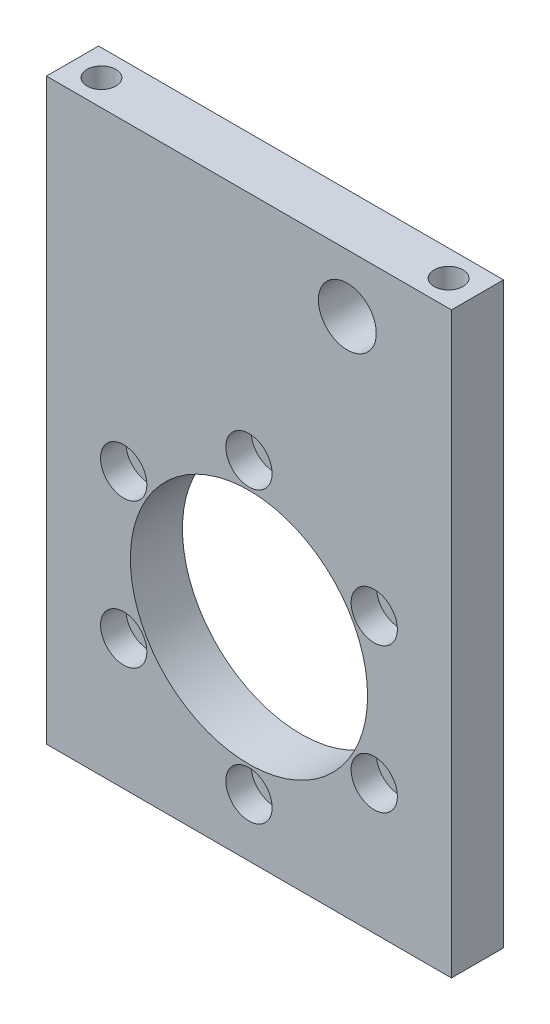
ISO-10303-21;
HEADER;
FILE_DESCRIPTION(('STEP AP214'),'2;1');
FILE_NAME('part.step','',(''),(''),'','','');
FILE_SCHEMA(('AUTOMOTIVE_DESIGN { 1 0 10303 214 1 1 1 1 }'));
ENDSEC;
DATA;
#1=APPLICATION_CONTEXT('core data for automotive mechanical design processes');
#2=APPLICATION_PROTOCOL_DEFINITION('international standard','automotive_design',2000,#1);
#3=PRODUCT_CONTEXT('',#1,'mechanical');
#4=PRODUCT('Part','Part','',(#3));
#5=PRODUCT_RELATED_PRODUCT_CATEGORY('part','',(#4));
#6=PRODUCT_DEFINITION_FORMATION('','',#4);
#7=PRODUCT_DEFINITION_CONTEXT('part definition',#1,'design');
#8=PRODUCT_DEFINITION('design','',#6,#7);
#9=PRODUCT_DEFINITION_SHAPE('','',#8);
#10=(LENGTH_UNIT() NAMED_UNIT(*) SI_UNIT(.MILLI.,.METRE.));
#11=(NAMED_UNIT(*) PLANE_ANGLE_UNIT() SI_UNIT($,.RADIAN.));
#12=(NAMED_UNIT(*) SI_UNIT($,.STERADIAN.) SOLID_ANGLE_UNIT());
#13=UNCERTAINTY_MEASURE_WITH_UNIT(LENGTH_MEASURE(1.E-05),#10,'distance_accuracy_value','');
#14=(GEOMETRIC_REPRESENTATION_CONTEXT(3) GLOBAL_UNCERTAINTY_ASSIGNED_CONTEXT((#13)) GLOBAL_UNIT_ASSIGNED_CONTEXT((#10,
#11,#12)) REPRESENTATION_CONTEXT('',''));
#15=CARTESIAN_POINT('',(0.,0.,0.));
#16=DIRECTION('',(0.,0.,1.));
#17=DIRECTION('',(1.,0.,0.));
#18=AXIS2_PLACEMENT_3D('',#15,#16,#17);
#19=CARTESIAN_POINT('',(0.,0.,4.5));
#20=DIRECTION('',(0.,0.,-1.));
#21=DIRECTION('',(-1.,0.,0.));
#22=AXIS2_PLACEMENT_3D('',#19,#20,#21);
#23=PLANE('',#22);
#24=CARTESIAN_POINT('',(52.,90.,4.5));
#25=DIRECTION('',(0.,0.,1.));
#26=DIRECTION('',(1.,0.,0.));
#27=AXIS2_PLACEMENT_3D('',#24,#25,#26);
#28=CIRCLE('',#27,5.);
#29=CARTESIAN_POINT('',(57.,90.,4.5));
#30=VERTEX_POINT('',#29);
#31=EDGE_CURVE('E301',#30,#30,#28,.T.);
#32=ORIENTED_EDGE('',*,*,#31,.F.);
#33=EDGE_LOOP('',(#32));
#34=FACE_BOUND('',#33,.T.);
#35=CARTESIAN_POINT('',(56.6506350946108,47.5000000000003,4.5));
#36=DIRECTION('',(0.,0.,1.));
#37=DIRECTION('',(1.,0.,0.));
#38=AXIS2_PLACEMENT_3D('',#35,#36,#37);
#39=CIRCLE('',#38,4.);
#40=CARTESIAN_POINT('',(60.6506350946108,47.5000000000003,4.5));
#41=VERTEX_POINT('',#40);
#42=EDGE_CURVE('E303',#41,#41,#39,.T.);
#43=ORIENTED_EDGE('',*,*,#42,.F.);
#44=EDGE_LOOP('',(#43));
#45=FACE_BOUND('',#44,.T.);
#46=CARTESIAN_POINT('',(56.6506350946111,22.5000000000002,4.5));
#47=DIRECTION('',(0.,0.,1.));
#48=DIRECTION('',(1.,0.,0.));
#49=AXIS2_PLACEMENT_3D('',#46,#47,#48);
#50=CIRCLE('',#49,4.);
#51=CARTESIAN_POINT('',(60.6506350946111,22.5000000000002,4.5));
#52=VERTEX_POINT('',#51);
#53=EDGE_CURVE('E316',#52,#52,#50,.T.);
#54=ORIENTED_EDGE('',*,*,#53,.F.);
#55=EDGE_LOOP('',(#54));
#56=FACE_BOUND('',#55,.T.);
#57=CARTESIAN_POINT('',(35.,10.,4.5));
#58=DIRECTION('',(0.,0.,1.));
#59=DIRECTION('',(1.,0.,0.));
#60=AXIS2_PLACEMENT_3D('',#57,#58,#59);
#61=CIRCLE('',#60,4.);
#62=CARTESIAN_POINT('',(39.,10.,4.5));
#63=VERTEX_POINT('',#62);
#64=EDGE_CURVE('E328',#63,#63,#61,.T.);
#65=ORIENTED_EDGE('',*,*,#64,.F.);
#66=EDGE_LOOP('',(#65));
#67=FACE_BOUND('',#66,.T.);
#68=CARTESIAN_POINT('',(13.3493649053891,22.4999999999999,4.5));
#69=DIRECTION('',(0.,0.,1.));
#70=DIRECTION('',(1.,0.,0.));
#71=AXIS2_PLACEMENT_3D('',#68,#69,#70);
#72=CIRCLE('',#71,4.);
#73=CARTESIAN_POINT('',(17.3493649053891,22.4999999999999,4.5));
#74=VERTEX_POINT('',#73);
#75=EDGE_CURVE('E340',#74,#74,#72,.T.);
#76=ORIENTED_EDGE('',*,*,#75,.F.);
#77=EDGE_LOOP('',(#76));
#78=FACE_BOUND('',#77,.T.);
#79=CARTESIAN_POINT('',(35.,60.,4.5));
#80=DIRECTION('',(0.,0.,1.));
#81=DIRECTION('',(1.,0.,0.));
#82=AXIS2_PLACEMENT_3D('',#79,#80,#81);
#83=CIRCLE('',#82,4.);
#84=CARTESIAN_POINT('',(39.,60.,4.5));
#85=VERTEX_POINT('',#84);
#86=EDGE_CURVE('E364',#85,#85,#83,.T.);
#87=ORIENTED_EDGE('',*,*,#86,.F.);
#88=EDGE_LOOP('',(#87));
#89=FACE_BOUND('',#88,.T.);
#90=CARTESIAN_POINT('',(35.,35.,4.5));
#91=DIRECTION('',(0.,0.,1.));
#92=DIRECTION('',(1.,0.,0.));
#93=AXIS2_PLACEMENT_3D('',#90,#91,#92);
#94=CIRCLE('',#93,20.5);
#95=CARTESIAN_POINT('',(55.5,35.,4.5));
#96=VERTEX_POINT('',#95);
#97=EDGE_CURVE('E135',#96,#96,#94,.T.);
#98=ORIENTED_EDGE('',*,*,#97,.F.);
#99=EDGE_LOOP('',(#98));
#100=FACE_BOUND('',#99,.T.);
#101=DIRECTION('',(0.,-1.,0.));
#102=VECTOR('',#101,1.);
#103=CARTESIAN_POINT('',(0.,0.,4.5));
#104=LINE('',#103,#102);
#105=CARTESIAN_POINT('',(0.,100.,4.5));
#106=VERTEX_POINT('',#105);
#107=CARTESIAN_POINT('',(0.,0.,4.5));
#108=VERTEX_POINT('',#107);
#109=EDGE_CURVE('E142',#106,#108,#104,.T.);
#110=ORIENTED_EDGE('',*,*,#109,.T.);
#111=DIRECTION('',(1.,0.,0.));
#112=VECTOR('',#111,1.);
#113=CARTESIAN_POINT('',(0.,0.,4.5));
#114=LINE('',#113,#112);
#115=CARTESIAN_POINT('',(70.,0.,4.5));
#116=VERTEX_POINT('',#115);
#117=EDGE_CURVE('E87',#108,#116,#114,.T.);
#118=ORIENTED_EDGE('',*,*,#117,.T.);
#119=DIRECTION('',(0.,1.,0.));
#120=VECTOR('',#119,1.);
#121=CARTESIAN_POINT('',(70.,0.,4.5));
#122=LINE('',#121,#120);
#123=CARTESIAN_POINT('',(70.,100.,4.5));
#124=VERTEX_POINT('',#123);
#125=EDGE_CURVE('E145',#116,#124,#122,.T.);
#126=ORIENTED_EDGE('',*,*,#125,.T.);
#127=DIRECTION('',(-1.,0.,0.));
#128=VECTOR('',#127,1.);
#129=CARTESIAN_POINT('',(0.,100.,4.5));
#130=LINE('',#129,#128);
#131=EDGE_CURVE('E56',#124,#106,#130,.T.);
#132=ORIENTED_EDGE('',*,*,#131,.T.);
#133=EDGE_LOOP('',(#110,#118,#126,#132));
#134=FACE_BOUND('',#133,.T.);
#135=CARTESIAN_POINT('',(13.349364905389,47.5,4.5));
#136=DIRECTION('',(0.,0.,1.));
#137=DIRECTION('',(1.,0.,0.));
#138=AXIS2_PLACEMENT_3D('',#135,#136,#137);
#139=CIRCLE('',#138,4.);
#140=CARTESIAN_POINT('',(17.349364905389,47.5,4.5));
#141=VERTEX_POINT('',#140);
#142=EDGE_CURVE('E352',#141,#141,#139,.T.);
#143=ORIENTED_EDGE('',*,*,#142,.F.);
#144=EDGE_LOOP('',(#143));
#145=FACE_BOUND('',#144,.T.);
#146=ADVANCED_FACE('F38',(#34,#45,#56,#67,#78,#89,#100,#134,#145),#23,.F.);
#147=CARTESIAN_POINT('',(0.,0.,4.5));
#148=DIRECTION('',(1.,0.,0.));
#149=DIRECTION('',(0.,0.,-1.));
#150=AXIS2_PLACEMENT_3D('',#147,#148,#149);
#151=PLANE('',#150);
#152=DIRECTION('',(0.,-1.,0.));
#153=VECTOR('',#152,1.);
#154=CARTESIAN_POINT('',(0.,0.,-4.5));
#155=LINE('',#154,#153);
#156=CARTESIAN_POINT('',(0.,100.,-4.5));
#157=VERTEX_POINT('',#156);
#158=CARTESIAN_POINT('',(0.,0.,-4.5));
#159=VERTEX_POINT('',#158);
#160=EDGE_CURVE('E141',#157,#159,#155,.T.);
#161=ORIENTED_EDGE('',*,*,#160,.T.);
#162=DIRECTION('',(0.,0.,-1.));
#163=VECTOR('',#162,1.);
#164=CARTESIAN_POINT('',(0.,0.,4.5));
#165=LINE('',#164,#163);
#166=EDGE_CURVE('E11',#108,#159,#165,.T.);
#167=ORIENTED_EDGE('',*,*,#166,.F.);
#168=ORIENTED_EDGE('',*,*,#109,.F.);
#169=DIRECTION('',(0.,0.,-1.));
#170=VECTOR('',#169,1.);
#171=CARTESIAN_POINT('',(0.,100.,4.5));
#172=LINE('',#171,#170);
#173=EDGE_CURVE('E148',#106,#157,#172,.T.);
#174=ORIENTED_EDGE('',*,*,#173,.T.);
#175=EDGE_LOOP('',(#161,#167,#168,#174));
#176=FACE_BOUND('',#175,.T.);
#177=ADVANCED_FACE('F40',(#176),#151,.F.);
#178=CARTESIAN_POINT('',(0.,0.,4.5));
#179=DIRECTION('',(0.,1.,0.));
#180=DIRECTION('',(0.,0.,1.));
#181=AXIS2_PLACEMENT_3D('',#178,#179,#180);
#182=PLANE('',#181);
#183=CARTESIAN_POINT('',(65.,0.,0.));
#184=DIRECTION('',(0.,-1.,0.));
#185=DIRECTION('',(0.,0.,-1.));
#186=AXIS2_PLACEMENT_3D('',#183,#184,#185);
#187=CIRCLE('',#186,2.49999999999999);
#188=CARTESIAN_POINT('',(65.,0.,-2.49999999999999));
#189=VERTEX_POINT('',#188);
#190=EDGE_CURVE('E123',#189,#189,#187,.T.);
#191=ORIENTED_EDGE('',*,*,#190,.F.);
#192=EDGE_LOOP('',(#191));
#193=FACE_BOUND('',#192,.T.);
#194=CARTESIAN_POINT('',(5.,0.,0.));
#195=DIRECTION('',(0.,-1.,0.));
#196=DIRECTION('',(0.,0.,-1.));
#197=AXIS2_PLACEMENT_3D('',#194,#195,#196);
#198=CIRCLE('',#197,2.49999999999999);
#199=CARTESIAN_POINT('',(5.,0.,-2.49999999999999));
#200=VERTEX_POINT('',#199);
#201=EDGE_CURVE('E129',#200,#200,#198,.T.);
#202=ORIENTED_EDGE('',*,*,#201,.F.);
#203=EDGE_LOOP('',(#202));
#204=FACE_BOUND('',#203,.T.);
#205=DIRECTION('',(1.,0.,0.));
#206=VECTOR('',#205,1.);
#207=CARTESIAN_POINT('',(0.,0.,-4.5));
#208=LINE('',#207,#206);
#209=CARTESIAN_POINT('',(70.,0.,-4.5));
#210=VERTEX_POINT('',#209);
#211=EDGE_CURVE('E151',#159,#210,#208,.T.);
#212=ORIENTED_EDGE('',*,*,#211,.T.);
#213=DIRECTION('',(0.,0.,-1.));
#214=VECTOR('',#213,1.);
#215=CARTESIAN_POINT('',(70.,0.,4.5));
#216=LINE('',#215,#214);
#217=EDGE_CURVE('E48',#116,#210,#216,.T.);
#218=ORIENTED_EDGE('',*,*,#217,.F.);
#219=ORIENTED_EDGE('',*,*,#117,.F.);
#220=ORIENTED_EDGE('',*,*,#166,.T.);
#221=EDGE_LOOP('',(#212,#218,#219,#220));
#222=FACE_BOUND('',#221,.T.);
#223=ADVANCED_FACE('F178',(#193,#204,#222),#182,.F.);
#224=CARTESIAN_POINT('',(70.,0.,4.5));
#225=DIRECTION('',(-1.,0.,0.));
#226=DIRECTION('',(0.,0.,1.));
#227=AXIS2_PLACEMENT_3D('',#224,#225,#226);
#228=PLANE('',#227);
#229=DIRECTION('',(0.,1.,0.));
#230=VECTOR('',#229,1.);
#231=CARTESIAN_POINT('',(70.,0.,-4.5));
#232=LINE('',#231,#230);
#233=CARTESIAN_POINT('',(70.,100.,-4.5));
#234=VERTEX_POINT('',#233);
#235=EDGE_CURVE('E74',#210,#234,#232,.T.);
#236=ORIENTED_EDGE('',*,*,#235,.T.);
#237=DIRECTION('',(0.,0.,-1.));
#238=VECTOR('',#237,1.);
#239=CARTESIAN_POINT('',(70.,100.,4.5));
#240=LINE('',#239,#238);
#241=EDGE_CURVE('E156',#124,#234,#240,.T.);
#242=ORIENTED_EDGE('',*,*,#241,.F.);
#243=ORIENTED_EDGE('',*,*,#125,.F.);
#244=ORIENTED_EDGE('',*,*,#217,.T.);
#245=EDGE_LOOP('',(#236,#242,#243,#244));
#246=FACE_BOUND('',#245,.T.);
#247=ADVANCED_FACE('F159',(#246),#228,.F.);
#248=CARTESIAN_POINT('',(0.,100.,4.5));
#249=DIRECTION('',(0.,-1.,0.));
#250=DIRECTION('',(0.,0.,-1.));
#251=AXIS2_PLACEMENT_3D('',#248,#249,#250);
#252=PLANE('',#251);
#253=CARTESIAN_POINT('',(65.,100.,0.));
#254=DIRECTION('',(0.,1.,0.));
#255=DIRECTION('',(0.,0.,1.));
#256=AXIS2_PLACEMENT_3D('',#253,#254,#255);
#257=CIRCLE('',#256,2.49999999999999);
#258=CARTESIAN_POINT('',(65.,100.,2.49999999999999));
#259=VERTEX_POINT('',#258);
#260=EDGE_CURVE('E111',#259,#259,#257,.T.);
#261=ORIENTED_EDGE('',*,*,#260,.F.);
#262=EDGE_LOOP('',(#261));
#263=FACE_BOUND('',#262,.T.);
#264=CARTESIAN_POINT('',(5.,100.,0.));
#265=DIRECTION('',(0.,1.,0.));
#266=DIRECTION('',(0.,0.,1.));
#267=AXIS2_PLACEMENT_3D('',#264,#265,#266);
#268=CIRCLE('',#267,2.49999999999999);
#269=CARTESIAN_POINT('',(5.,100.,2.49999999999999));
#270=VERTEX_POINT('',#269);
#271=EDGE_CURVE('E110',#270,#270,#268,.T.);
#272=ORIENTED_EDGE('',*,*,#271,.F.);
#273=EDGE_LOOP('',(#272));
#274=FACE_BOUND('',#273,.T.);
#275=DIRECTION('',(-1.,0.,0.));
#276=VECTOR('',#275,1.);
#277=CARTESIAN_POINT('',(0.,100.,-4.5));
#278=LINE('',#277,#276);
#279=EDGE_CURVE('E80',#234,#157,#278,.T.);
#280=ORIENTED_EDGE('',*,*,#279,.T.);
#281=ORIENTED_EDGE('',*,*,#173,.F.);
#282=ORIENTED_EDGE('',*,*,#131,.F.);
#283=ORIENTED_EDGE('',*,*,#241,.T.);
#284=EDGE_LOOP('',(#280,#281,#282,#283));
#285=FACE_BOUND('',#284,.T.);
#286=ADVANCED_FACE('F166',(#263,#274,#285),#252,.F.);
#287=CARTESIAN_POINT('',(0.,0.,-4.5));
#288=DIRECTION('',(0.,0.,-1.));
#289=DIRECTION('',(-1.,0.,0.));
#290=AXIS2_PLACEMENT_3D('',#287,#288,#289);
#291=PLANE('',#290);
#292=CARTESIAN_POINT('',(52.,90.,-4.5));
#293=DIRECTION('',(0.,0.,-1.));
#294=DIRECTION('',(-1.,0.,0.));
#295=AXIS2_PLACEMENT_3D('',#292,#293,#294);
#296=CIRCLE('',#295,5.);
#297=CARTESIAN_POINT('',(47.,90.,-4.5));
#298=VERTEX_POINT('',#297);
#299=EDGE_CURVE('E42',#298,#298,#296,.T.);
#300=ORIENTED_EDGE('',*,*,#299,.F.);
#301=EDGE_LOOP('',(#300));
#302=FACE_BOUND('',#301,.T.);
#303=CARTESIAN_POINT('',(56.6506350946108,47.5000000000003,-4.5));
#304=DIRECTION('',(0.,0.,1.));
#305=DIRECTION('',(1.,0.,0.));
#306=AXIS2_PLACEMENT_3D('',#303,#304,#305);
#307=CIRCLE('',#306,2.15);
#308=CARTESIAN_POINT('',(58.8006350946108,47.5000000000003,-4.5));
#309=VERTEX_POINT('',#308);
#310=EDGE_CURVE('E313',#309,#309,#307,.T.);
#311=ORIENTED_EDGE('',*,*,#310,.T.);
#312=EDGE_LOOP('',(#311));
#313=FACE_BOUND('',#312,.T.);
#314=CARTESIAN_POINT('',(56.6506350946111,22.5000000000002,-4.5));
#315=DIRECTION('',(0.,0.,1.));
#316=DIRECTION('',(1.,0.,0.));
#317=AXIS2_PLACEMENT_3D('',#314,#315,#316);
#318=CIRCLE('',#317,2.15);
#319=CARTESIAN_POINT('',(58.8006350946111,22.5000000000002,-4.5));
#320=VERTEX_POINT('',#319);
#321=EDGE_CURVE('E325',#320,#320,#318,.T.);
#322=ORIENTED_EDGE('',*,*,#321,.T.);
#323=EDGE_LOOP('',(#322));
#324=FACE_BOUND('',#323,.T.);
#325=CARTESIAN_POINT('',(35.,10.,-4.5));
#326=DIRECTION('',(0.,0.,1.));
#327=DIRECTION('',(1.,0.,0.));
#328=AXIS2_PLACEMENT_3D('',#325,#326,#327);
#329=CIRCLE('',#328,2.15);
#330=CARTESIAN_POINT('',(37.15,10.,-4.5));
#331=VERTEX_POINT('',#330);
#332=EDGE_CURVE('E337',#331,#331,#329,.T.);
#333=ORIENTED_EDGE('',*,*,#332,.T.);
#334=EDGE_LOOP('',(#333));
#335=FACE_BOUND('',#334,.T.);
#336=CARTESIAN_POINT('',(13.3493649053891,22.4999999999999,-4.5));
#337=DIRECTION('',(0.,0.,1.));
#338=DIRECTION('',(1.,0.,0.));
#339=AXIS2_PLACEMENT_3D('',#336,#337,#338);
#340=CIRCLE('',#339,2.15);
#341=CARTESIAN_POINT('',(15.4993649053891,22.4999999999999,-4.5));
#342=VERTEX_POINT('',#341);
#343=EDGE_CURVE('E349',#342,#342,#340,.T.);
#344=ORIENTED_EDGE('',*,*,#343,.T.);
#345=EDGE_LOOP('',(#344));
#346=FACE_BOUND('',#345,.T.);
#347=CARTESIAN_POINT('',(13.349364905389,47.5,-4.5));
#348=DIRECTION('',(0.,0.,1.));
#349=DIRECTION('',(1.,0.,0.));
#350=AXIS2_PLACEMENT_3D('',#347,#348,#349);
#351=CIRCLE('',#350,2.15);
#352=CARTESIAN_POINT('',(15.499364905389,47.5,-4.5));
#353=VERTEX_POINT('',#352);
#354=EDGE_CURVE('E361',#353,#353,#351,.T.);
#355=ORIENTED_EDGE('',*,*,#354,.T.);
#356=EDGE_LOOP('',(#355));
#357=FACE_BOUND('',#356,.T.);
#358=CARTESIAN_POINT('',(35.,60.,-4.5));
#359=DIRECTION('',(0.,0.,1.));
#360=DIRECTION('',(1.,0.,0.));
#361=AXIS2_PLACEMENT_3D('',#358,#359,#360);
#362=CIRCLE('',#361,2.15);
#363=CARTESIAN_POINT('',(37.15,60.,-4.5));
#364=VERTEX_POINT('',#363);
#365=EDGE_CURVE('E117',#364,#364,#362,.T.);
#366=ORIENTED_EDGE('',*,*,#365,.T.);
#367=EDGE_LOOP('',(#366));
#368=FACE_BOUND('',#367,.T.);
#369=CARTESIAN_POINT('',(35.,35.,-4.5));
#370=DIRECTION('',(0.,0.,1.));
#371=DIRECTION('',(1.,0.,0.));
#372=AXIS2_PLACEMENT_3D('',#369,#370,#371);
#373=CIRCLE('',#372,20.5);
#374=CARTESIAN_POINT('',(55.5,35.,-4.5));
#375=VERTEX_POINT('',#374);
#376=EDGE_CURVE('E138',#375,#375,#373,.T.);
#377=ORIENTED_EDGE('',*,*,#376,.T.);
#378=EDGE_LOOP('',(#377));
#379=FACE_BOUND('',#378,.T.);
#380=ORIENTED_EDGE('',*,*,#160,.F.);
#381=ORIENTED_EDGE('',*,*,#279,.F.);
#382=ORIENTED_EDGE('',*,*,#235,.F.);
#383=ORIENTED_EDGE('',*,*,#211,.F.);
#384=EDGE_LOOP('',(#380,#381,#382,#383));
#385=FACE_BOUND('',#384,.T.);
#386=ADVANCED_FACE('F162',(#302,#313,#324,#335,#346,#357,#368,#379,#385),#291,.T.);
#387=CARTESIAN_POINT('',(35.,35.,-4.5));
#388=DIRECTION('',(0.,0.,1.));
#389=DIRECTION('',(1.,0.,0.));
#390=AXIS2_PLACEMENT_3D('',#387,#388,#389);
#391=CYLINDRICAL_SURFACE('',#390,20.5);
#392=ORIENTED_EDGE('',*,*,#376,.F.);
#393=EDGE_LOOP('',(#392));
#394=FACE_BOUND('',#393,.T.);
#395=ORIENTED_EDGE('',*,*,#97,.T.);
#396=EDGE_LOOP('',(#395));
#397=FACE_BOUND('',#396,.T.);
#398=ADVANCED_FACE('F175',(#394,#397),#391,.F.);
#399=CARTESIAN_POINT('',(5.,15.,0.));
#400=DIRECTION('',(0.,-1.,0.));
#401=DIRECTION('',(0.,0.,-1.));
#402=AXIS2_PLACEMENT_3D('',#399,#400,#401);
#403=CONICAL_SURFACE('',#402,2.49999999999999,1.02974425867665);
#404=CARTESIAN_POINT('',(5.,16.5021515475689,0.));
#405=VERTEX_POINT('',#404);
#406=VERTEX_LOOP('',#405);
#407=FACE_BOUND('',#406,.T.);
#408=CARTESIAN_POINT('',(5.,15.,0.));
#409=DIRECTION('',(0.,-1.,0.));
#410=DIRECTION('',(0.,0.,-1.));
#411=AXIS2_PLACEMENT_3D('',#408,#409,#410);
#412=CIRCLE('',#411,2.49999999999999);
#413=CARTESIAN_POINT('',(5.,15.,-2.49999999999999));
#414=VERTEX_POINT('',#413);
#415=EDGE_CURVE('E132',#414,#414,#412,.T.);
#416=ORIENTED_EDGE('',*,*,#415,.T.);
#417=EDGE_LOOP('',(#416));
#418=FACE_BOUND('',#417,.T.);
#419=ADVANCED_FACE('F194',(#407,#418),#403,.F.);
#420=CARTESIAN_POINT('',(5.,0.,0.));
#421=DIRECTION('',(0.,-1.,0.));
#422=DIRECTION('',(0.,0.,-1.));
#423=AXIS2_PLACEMENT_3D('',#420,#421,#422);
#424=CYLINDRICAL_SURFACE('',#423,2.49999999999999);
#425=ORIENTED_EDGE('',*,*,#415,.F.);
#426=EDGE_LOOP('',(#425));
#427=FACE_BOUND('',#426,.T.);
#428=ORIENTED_EDGE('',*,*,#201,.T.);
#429=EDGE_LOOP('',(#428));
#430=FACE_BOUND('',#429,.T.);
#431=ADVANCED_FACE('F198',(#427,#430),#424,.F.);
#432=CARTESIAN_POINT('',(65.,15.,0.));
#433=DIRECTION('',(0.,-1.,0.));
#434=DIRECTION('',(0.,0.,-1.));
#435=AXIS2_PLACEMENT_3D('',#432,#433,#434);
#436=CONICAL_SURFACE('',#435,2.49999999999999,1.02974425867665);
#437=CARTESIAN_POINT('',(65.,16.5021515475689,0.));
#438=VERTEX_POINT('',#437);
#439=VERTEX_LOOP('',#438);
#440=FACE_BOUND('',#439,.T.);
#441=CARTESIAN_POINT('',(65.,15.,0.));
#442=DIRECTION('',(0.,-1.,0.));
#443=DIRECTION('',(0.,0.,-1.));
#444=AXIS2_PLACEMENT_3D('',#441,#442,#443);
#445=CIRCLE('',#444,2.49999999999999);
#446=CARTESIAN_POINT('',(65.,15.,-2.49999999999999));
#447=VERTEX_POINT('',#446);
#448=EDGE_CURVE('E126',#447,#447,#445,.T.);
#449=ORIENTED_EDGE('',*,*,#448,.T.);
#450=EDGE_LOOP('',(#449));
#451=FACE_BOUND('',#450,.T.);
#452=ADVANCED_FACE('F202',(#440,#451),#436,.F.);
#453=CARTESIAN_POINT('',(65.,0.,0.));
#454=DIRECTION('',(0.,-1.,0.));
#455=DIRECTION('',(0.,0.,-1.));
#456=AXIS2_PLACEMENT_3D('',#453,#454,#455);
#457=CYLINDRICAL_SURFACE('',#456,2.49999999999999);
#458=ORIENTED_EDGE('',*,*,#448,.F.);
#459=EDGE_LOOP('',(#458));
#460=FACE_BOUND('',#459,.T.);
#461=ORIENTED_EDGE('',*,*,#190,.T.);
#462=EDGE_LOOP('',(#461));
#463=FACE_BOUND('',#462,.T.);
#464=ADVANCED_FACE('F206',(#460,#463),#457,.F.);
#465=CARTESIAN_POINT('',(5.,85.,0.));
#466=DIRECTION('',(0.,1.,0.));
#467=DIRECTION('',(0.,0.,1.));
#468=AXIS2_PLACEMENT_3D('',#465,#466,#467);
#469=CONICAL_SURFACE('',#468,2.49999999999999,1.02974425867665);
#470=CARTESIAN_POINT('',(5.,83.4978484524311,0.));
#471=VERTEX_POINT('',#470);
#472=VERTEX_LOOP('',#471);
#473=FACE_BOUND('',#472,.T.);
#474=CARTESIAN_POINT('',(5.,85.,0.));
#475=DIRECTION('',(0.,1.,0.));
#476=DIRECTION('',(0.,0.,1.));
#477=AXIS2_PLACEMENT_3D('',#474,#475,#476);
#478=CIRCLE('',#477,2.49999999999999);
#479=CARTESIAN_POINT('',(5.,85.,2.49999999999999));
#480=VERTEX_POINT('',#479);
#481=EDGE_CURVE('E114',#480,#480,#478,.T.);
#482=ORIENTED_EDGE('',*,*,#481,.T.);
#483=EDGE_LOOP('',(#482));
#484=FACE_BOUND('',#483,.T.);
#485=ADVANCED_FACE('F210',(#473,#484),#469,.F.);
#486=CARTESIAN_POINT('',(5.,100.,0.));
#487=DIRECTION('',(0.,1.,0.));
#488=DIRECTION('',(0.,0.,1.));
#489=AXIS2_PLACEMENT_3D('',#486,#487,#488);
#490=CYLINDRICAL_SURFACE('',#489,2.49999999999999);
#491=ORIENTED_EDGE('',*,*,#481,.F.);
#492=EDGE_LOOP('',(#491));
#493=FACE_BOUND('',#492,.T.);
#494=ORIENTED_EDGE('',*,*,#271,.T.);
#495=EDGE_LOOP('',(#494));
#496=FACE_BOUND('',#495,.T.);
#497=ADVANCED_FACE('F104',(#493,#496),#490,.F.);
#498=CARTESIAN_POINT('',(65.,85.,0.));
#499=DIRECTION('',(0.,1.,0.));
#500=DIRECTION('',(0.,0.,1.));
#501=AXIS2_PLACEMENT_3D('',#498,#499,#500);
#502=CONICAL_SURFACE('',#501,2.49999999999999,1.02974425867665);
#503=CARTESIAN_POINT('',(65.,83.4978484524311,0.));
#504=VERTEX_POINT('',#503);
#505=VERTEX_LOOP('',#504);
#506=FACE_BOUND('',#505,.T.);
#507=CARTESIAN_POINT('',(65.,85.,0.));
#508=DIRECTION('',(0.,1.,0.));
#509=DIRECTION('',(0.,0.,1.));
#510=AXIS2_PLACEMENT_3D('',#507,#508,#509);
#511=CIRCLE('',#510,2.49999999999999);
#512=CARTESIAN_POINT('',(65.,85.,2.49999999999999));
#513=VERTEX_POINT('',#512);
#514=EDGE_CURVE('E108',#513,#513,#511,.T.);
#515=ORIENTED_EDGE('',*,*,#514,.T.);
#516=EDGE_LOOP('',(#515));
#517=FACE_BOUND('',#516,.T.);
#518=ADVANCED_FACE('F100',(#506,#517),#502,.F.);
#519=CARTESIAN_POINT('',(65.,100.,0.));
#520=DIRECTION('',(0.,1.,0.));
#521=DIRECTION('',(0.,0.,1.));
#522=AXIS2_PLACEMENT_3D('',#519,#520,#521);
#523=CYLINDRICAL_SURFACE('',#522,2.49999999999999);
#524=ORIENTED_EDGE('',*,*,#514,.F.);
#525=EDGE_LOOP('',(#524));
#526=FACE_BOUND('',#525,.T.);
#527=ORIENTED_EDGE('',*,*,#260,.T.);
#528=EDGE_LOOP('',(#527));
#529=FACE_BOUND('',#528,.T.);
#530=ADVANCED_FACE('F103',(#526,#529),#523,.F.);
#531=CARTESIAN_POINT('',(35.,60.,4.5));
#532=DIRECTION('',(0.,0.,1.));
#533=DIRECTION('',(1.,0.,0.));
#534=AXIS2_PLACEMENT_3D('',#531,#532,#533);
#535=CYLINDRICAL_SURFACE('',#534,2.15);
#536=ORIENTED_EDGE('',*,*,#365,.F.);
#537=EDGE_LOOP('',(#536));
#538=FACE_BOUND('',#537,.T.);
#539=CARTESIAN_POINT('',(35.,60.,0.1));
#540=DIRECTION('',(0.,0.,1.));
#541=DIRECTION('',(1.,0.,0.));
#542=AXIS2_PLACEMENT_3D('',#539,#540,#541);
#543=CIRCLE('',#542,2.15);
#544=CARTESIAN_POINT('',(37.15,60.,0.1));
#545=VERTEX_POINT('',#544);
#546=EDGE_CURVE('E370',#545,#545,#543,.T.);
#547=ORIENTED_EDGE('',*,*,#546,.T.);
#548=EDGE_LOOP('',(#547));
#549=FACE_BOUND('',#548,.T.);
#550=ADVANCED_FACE('F220',(#538,#549),#535,.F.);
#551=CARTESIAN_POINT('',(37.15,60.,0.1));
#552=DIRECTION('',(0.,0.,-1.));
#553=DIRECTION('',(-1.,0.,0.));
#554=AXIS2_PLACEMENT_3D('',#551,#552,#553);
#555=PLANE('',#554);
#556=ORIENTED_EDGE('',*,*,#546,.F.);
#557=EDGE_LOOP('',(#556));
#558=FACE_BOUND('',#557,.T.);
#559=CARTESIAN_POINT('',(35.,60.,0.1));
#560=DIRECTION('',(0.,0.,1.));
#561=DIRECTION('',(1.,0.,0.));
#562=AXIS2_PLACEMENT_3D('',#559,#560,#561);
#563=CIRCLE('',#562,4.);
#564=CARTESIAN_POINT('',(39.,60.,0.1));
#565=VERTEX_POINT('',#564);
#566=EDGE_CURVE('E367',#565,#565,#563,.T.);
#567=ORIENTED_EDGE('',*,*,#566,.T.);
#568=EDGE_LOOP('',(#567));
#569=FACE_BOUND('',#568,.T.);
#570=ADVANCED_FACE('F223',(#558,#569),#555,.F.);
#571=CARTESIAN_POINT('',(35.,60.,4.5));
#572=DIRECTION('',(0.,0.,1.));
#573=DIRECTION('',(1.,0.,0.));
#574=AXIS2_PLACEMENT_3D('',#571,#572,#573);
#575=CYLINDRICAL_SURFACE('',#574,4.);
#576=ORIENTED_EDGE('',*,*,#566,.F.);
#577=EDGE_LOOP('',(#576));
#578=FACE_BOUND('',#577,.T.);
#579=ORIENTED_EDGE('',*,*,#86,.T.);
#580=EDGE_LOOP('',(#579));
#581=FACE_BOUND('',#580,.T.);
#582=ADVANCED_FACE('F227',(#578,#581),#575,.F.);
#583=CARTESIAN_POINT('',(13.349364905389,47.5,4.5));
#584=DIRECTION('',(0.,0.,1.));
#585=DIRECTION('',(1.,0.,0.));
#586=AXIS2_PLACEMENT_3D('',#583,#584,#585);
#587=CYLINDRICAL_SURFACE('',#586,2.15);
#588=ORIENTED_EDGE('',*,*,#354,.F.);
#589=EDGE_LOOP('',(#588));
#590=FACE_BOUND('',#589,.T.);
#591=CARTESIAN_POINT('',(13.349364905389,47.5,0.1));
#592=DIRECTION('',(0.,0.,1.));
#593=DIRECTION('',(1.,0.,0.));
#594=AXIS2_PLACEMENT_3D('',#591,#592,#593);
#595=CIRCLE('',#594,2.15);
#596=CARTESIAN_POINT('',(15.499364905389,47.5,0.1));
#597=VERTEX_POINT('',#596);
#598=EDGE_CURVE('E358',#597,#597,#595,.T.);
#599=ORIENTED_EDGE('',*,*,#598,.T.);
#600=EDGE_LOOP('',(#599));
#601=FACE_BOUND('',#600,.T.);
#602=ADVANCED_FACE('F231',(#590,#601),#587,.F.);
#603=CARTESIAN_POINT('',(15.499364905389,47.5,0.1));
#604=DIRECTION('',(0.,0.,-1.));
#605=DIRECTION('',(-1.,0.,0.));
#606=AXIS2_PLACEMENT_3D('',#603,#604,#605);
#607=PLANE('',#606);
#608=ORIENTED_EDGE('',*,*,#598,.F.);
#609=EDGE_LOOP('',(#608));
#610=FACE_BOUND('',#609,.T.);
#611=CARTESIAN_POINT('',(13.349364905389,47.5,0.1));
#612=DIRECTION('',(0.,0.,1.));
#613=DIRECTION('',(1.,0.,0.));
#614=AXIS2_PLACEMENT_3D('',#611,#612,#613);
#615=CIRCLE('',#614,4.);
#616=CARTESIAN_POINT('',(17.349364905389,47.5,0.1));
#617=VERTEX_POINT('',#616);
#618=EDGE_CURVE('E355',#617,#617,#615,.T.);
#619=ORIENTED_EDGE('',*,*,#618,.T.);
#620=EDGE_LOOP('',(#619));
#621=FACE_BOUND('',#620,.T.);
#622=ADVANCED_FACE('F235',(#610,#621),#607,.F.);
#623=CARTESIAN_POINT('',(13.349364905389,47.5,4.5));
#624=DIRECTION('',(0.,0.,1.));
#625=DIRECTION('',(1.,0.,0.));
#626=AXIS2_PLACEMENT_3D('',#623,#624,#625);
#627=CYLINDRICAL_SURFACE('',#626,4.);
#628=ORIENTED_EDGE('',*,*,#618,.F.);
#629=EDGE_LOOP('',(#628));
#630=FACE_BOUND('',#629,.T.);
#631=ORIENTED_EDGE('',*,*,#142,.T.);
#632=EDGE_LOOP('',(#631));
#633=FACE_BOUND('',#632,.T.);
#634=ADVANCED_FACE('F239',(#630,#633),#627,.F.);
#635=CARTESIAN_POINT('',(13.3493649053891,22.4999999999999,4.5));
#636=DIRECTION('',(0.,0.,1.));
#637=DIRECTION('',(1.,0.,0.));
#638=AXIS2_PLACEMENT_3D('',#635,#636,#637);
#639=CYLINDRICAL_SURFACE('',#638,2.15);
#640=ORIENTED_EDGE('',*,*,#343,.F.);
#641=EDGE_LOOP('',(#640));
#642=FACE_BOUND('',#641,.T.);
#643=CARTESIAN_POINT('',(13.3493649053891,22.4999999999999,0.1));
#644=DIRECTION('',(0.,0.,1.));
#645=DIRECTION('',(1.,0.,0.));
#646=AXIS2_PLACEMENT_3D('',#643,#644,#645);
#647=CIRCLE('',#646,2.15);
#648=CARTESIAN_POINT('',(15.4993649053891,22.4999999999999,0.1));
#649=VERTEX_POINT('',#648);
#650=EDGE_CURVE('E346',#649,#649,#647,.T.);
#651=ORIENTED_EDGE('',*,*,#650,.T.);
#652=EDGE_LOOP('',(#651));
#653=FACE_BOUND('',#652,.T.);
#654=ADVANCED_FACE('F243',(#642,#653),#639,.F.);
#655=CARTESIAN_POINT('',(15.4993649053891,22.4999999999999,0.1));
#656=DIRECTION('',(0.,0.,-1.));
#657=DIRECTION('',(-1.,0.,0.));
#658=AXIS2_PLACEMENT_3D('',#655,#656,#657);
#659=PLANE('',#658);
#660=ORIENTED_EDGE('',*,*,#650,.F.);
#661=EDGE_LOOP('',(#660));
#662=FACE_BOUND('',#661,.T.);
#663=CARTESIAN_POINT('',(13.3493649053891,22.4999999999999,0.1));
#664=DIRECTION('',(0.,0.,1.));
#665=DIRECTION('',(1.,0.,0.));
#666=AXIS2_PLACEMENT_3D('',#663,#664,#665);
#667=CIRCLE('',#666,4.);
#668=CARTESIAN_POINT('',(17.3493649053891,22.4999999999999,0.1));
#669=VERTEX_POINT('',#668);
#670=EDGE_CURVE('E343',#669,#669,#667,.T.);
#671=ORIENTED_EDGE('',*,*,#670,.T.);
#672=EDGE_LOOP('',(#671));
#673=FACE_BOUND('',#672,.T.);
#674=ADVANCED_FACE('F247',(#662,#673),#659,.F.);
#675=CARTESIAN_POINT('',(13.3493649053891,22.4999999999999,4.5));
#676=DIRECTION('',(0.,0.,1.));
#677=DIRECTION('',(1.,0.,0.));
#678=AXIS2_PLACEMENT_3D('',#675,#676,#677);
#679=CYLINDRICAL_SURFACE('',#678,4.);
#680=ORIENTED_EDGE('',*,*,#670,.F.);
#681=EDGE_LOOP('',(#680));
#682=FACE_BOUND('',#681,.T.);
#683=ORIENTED_EDGE('',*,*,#75,.T.);
#684=EDGE_LOOP('',(#683));
#685=FACE_BOUND('',#684,.T.);
#686=ADVANCED_FACE('F251',(#682,#685),#679,.F.);
#687=CARTESIAN_POINT('',(35.,10.,4.5));
#688=DIRECTION('',(0.,0.,1.));
#689=DIRECTION('',(1.,0.,0.));
#690=AXIS2_PLACEMENT_3D('',#687,#688,#689);
#691=CYLINDRICAL_SURFACE('',#690,2.15);
#692=ORIENTED_EDGE('',*,*,#332,.F.);
#693=EDGE_LOOP('',(#692));
#694=FACE_BOUND('',#693,.T.);
#695=CARTESIAN_POINT('',(35.,10.,0.1));
#696=DIRECTION('',(0.,0.,1.));
#697=DIRECTION('',(1.,0.,0.));
#698=AXIS2_PLACEMENT_3D('',#695,#696,#697);
#699=CIRCLE('',#698,2.15);
#700=CARTESIAN_POINT('',(37.15,10.,0.1));
#701=VERTEX_POINT('',#700);
#702=EDGE_CURVE('E334',#701,#701,#699,.T.);
#703=ORIENTED_EDGE('',*,*,#702,.T.);
#704=EDGE_LOOP('',(#703));
#705=FACE_BOUND('',#704,.T.);
#706=ADVANCED_FACE('F255',(#694,#705),#691,.F.);
#707=CARTESIAN_POINT('',(37.15,10.,0.1));
#708=DIRECTION('',(0.,0.,-1.));
#709=DIRECTION('',(-1.,0.,0.));
#710=AXIS2_PLACEMENT_3D('',#707,#708,#709);
#711=PLANE('',#710);
#712=ORIENTED_EDGE('',*,*,#702,.F.);
#713=EDGE_LOOP('',(#712));
#714=FACE_BOUND('',#713,.T.);
#715=CARTESIAN_POINT('',(35.,10.,0.1));
#716=DIRECTION('',(0.,0.,1.));
#717=DIRECTION('',(1.,0.,0.));
#718=AXIS2_PLACEMENT_3D('',#715,#716,#717);
#719=CIRCLE('',#718,4.);
#720=CARTESIAN_POINT('',(39.,10.,0.1));
#721=VERTEX_POINT('',#720);
#722=EDGE_CURVE('E331',#721,#721,#719,.T.);
#723=ORIENTED_EDGE('',*,*,#722,.T.);
#724=EDGE_LOOP('',(#723));
#725=FACE_BOUND('',#724,.T.);
#726=ADVANCED_FACE('F259',(#714,#725),#711,.F.);
#727=CARTESIAN_POINT('',(35.,10.,4.5));
#728=DIRECTION('',(0.,0.,1.));
#729=DIRECTION('',(1.,0.,0.));
#730=AXIS2_PLACEMENT_3D('',#727,#728,#729);
#731=CYLINDRICAL_SURFACE('',#730,4.);
#732=ORIENTED_EDGE('',*,*,#722,.F.);
#733=EDGE_LOOP('',(#732));
#734=FACE_BOUND('',#733,.T.);
#735=ORIENTED_EDGE('',*,*,#64,.T.);
#736=EDGE_LOOP('',(#735));
#737=FACE_BOUND('',#736,.T.);
#738=ADVANCED_FACE('F263',(#734,#737),#731,.F.);
#739=CARTESIAN_POINT('',(56.6506350946111,22.5000000000002,4.5));
#740=DIRECTION('',(0.,0.,1.));
#741=DIRECTION('',(1.,0.,0.));
#742=AXIS2_PLACEMENT_3D('',#739,#740,#741);
#743=CYLINDRICAL_SURFACE('',#742,2.15);
#744=ORIENTED_EDGE('',*,*,#321,.F.);
#745=EDGE_LOOP('',(#744));
#746=FACE_BOUND('',#745,.T.);
#747=CARTESIAN_POINT('',(56.6506350946111,22.5000000000002,0.1));
#748=DIRECTION('',(0.,0.,1.));
#749=DIRECTION('',(1.,0.,0.));
#750=AXIS2_PLACEMENT_3D('',#747,#748,#749);
#751=CIRCLE('',#750,2.15);
#752=CARTESIAN_POINT('',(58.8006350946111,22.5000000000002,0.1));
#753=VERTEX_POINT('',#752);
#754=EDGE_CURVE('E322',#753,#753,#751,.T.);
#755=ORIENTED_EDGE('',*,*,#754,.T.);
#756=EDGE_LOOP('',(#755));
#757=FACE_BOUND('',#756,.T.);
#758=ADVANCED_FACE('F267',(#746,#757),#743,.F.);
#759=CARTESIAN_POINT('',(58.8006350946111,22.5000000000002,0.1));
#760=DIRECTION('',(0.,0.,-1.));
#761=DIRECTION('',(-1.,0.,0.));
#762=AXIS2_PLACEMENT_3D('',#759,#760,#761);
#763=PLANE('',#762);
#764=ORIENTED_EDGE('',*,*,#754,.F.);
#765=EDGE_LOOP('',(#764));
#766=FACE_BOUND('',#765,.T.);
#767=CARTESIAN_POINT('',(56.6506350946111,22.5000000000002,0.1));
#768=DIRECTION('',(0.,0.,1.));
#769=DIRECTION('',(1.,0.,0.));
#770=AXIS2_PLACEMENT_3D('',#767,#768,#769);
#771=CIRCLE('',#770,4.);
#772=CARTESIAN_POINT('',(60.6506350946111,22.5000000000002,0.1));
#773=VERTEX_POINT('',#772);
#774=EDGE_CURVE('E319',#773,#773,#771,.T.);
#775=ORIENTED_EDGE('',*,*,#774,.T.);
#776=EDGE_LOOP('',(#775));
#777=FACE_BOUND('',#776,.T.);
#778=ADVANCED_FACE('F271',(#766,#777),#763,.F.);
#779=CARTESIAN_POINT('',(56.6506350946111,22.5000000000002,4.5));
#780=DIRECTION('',(0.,0.,1.));
#781=DIRECTION('',(1.,0.,0.));
#782=AXIS2_PLACEMENT_3D('',#779,#780,#781);
#783=CYLINDRICAL_SURFACE('',#782,4.);
#784=ORIENTED_EDGE('',*,*,#774,.F.);
#785=EDGE_LOOP('',(#784));
#786=FACE_BOUND('',#785,.T.);
#787=ORIENTED_EDGE('',*,*,#53,.T.);
#788=EDGE_LOOP('',(#787));
#789=FACE_BOUND('',#788,.T.);
#790=ADVANCED_FACE('F275',(#786,#789),#783,.F.);
#791=CARTESIAN_POINT('',(56.6506350946108,47.5000000000003,4.5));
#792=DIRECTION('',(0.,0.,1.));
#793=DIRECTION('',(1.,0.,0.));
#794=AXIS2_PLACEMENT_3D('',#791,#792,#793);
#795=CYLINDRICAL_SURFACE('',#794,2.15);
#796=ORIENTED_EDGE('',*,*,#310,.F.);
#797=EDGE_LOOP('',(#796));
#798=FACE_BOUND('',#797,.T.);
#799=CARTESIAN_POINT('',(56.6506350946108,47.5000000000003,0.1));
#800=DIRECTION('',(0.,0.,1.));
#801=DIRECTION('',(1.,0.,0.));
#802=AXIS2_PLACEMENT_3D('',#799,#800,#801);
#803=CIRCLE('',#802,2.15);
#804=CARTESIAN_POINT('',(58.8006350946108,47.5000000000003,0.1));
#805=VERTEX_POINT('',#804);
#806=EDGE_CURVE('E310',#805,#805,#803,.T.);
#807=ORIENTED_EDGE('',*,*,#806,.T.);
#808=EDGE_LOOP('',(#807));
#809=FACE_BOUND('',#808,.T.);
#810=ADVANCED_FACE('F279',(#798,#809),#795,.F.);
#811=CARTESIAN_POINT('',(58.8006350946108,47.5000000000003,0.1));
#812=DIRECTION('',(0.,0.,-1.));
#813=DIRECTION('',(-1.,0.,0.));
#814=AXIS2_PLACEMENT_3D('',#811,#812,#813);
#815=PLANE('',#814);
#816=ORIENTED_EDGE('',*,*,#806,.F.);
#817=EDGE_LOOP('',(#816));
#818=FACE_BOUND('',#817,.T.);
#819=CARTESIAN_POINT('',(56.6506350946108,47.5000000000003,0.1));
#820=DIRECTION('',(0.,0.,1.));
#821=DIRECTION('',(1.,0.,0.));
#822=AXIS2_PLACEMENT_3D('',#819,#820,#821);
#823=CIRCLE('',#822,4.);
#824=CARTESIAN_POINT('',(60.6506350946108,47.5000000000003,0.1));
#825=VERTEX_POINT('',#824);
#826=EDGE_CURVE('E307',#825,#825,#823,.T.);
#827=ORIENTED_EDGE('',*,*,#826,.T.);
#828=EDGE_LOOP('',(#827));
#829=FACE_BOUND('',#828,.T.);
#830=ADVANCED_FACE('F283',(#818,#829),#815,.F.);
#831=CARTESIAN_POINT('',(56.6506350946108,47.5000000000003,4.5));
#832=DIRECTION('',(0.,0.,1.));
#833=DIRECTION('',(1.,0.,0.));
#834=AXIS2_PLACEMENT_3D('',#831,#832,#833);
#835=CYLINDRICAL_SURFACE('',#834,4.);
#836=ORIENTED_EDGE('',*,*,#826,.F.);
#837=EDGE_LOOP('',(#836));
#838=FACE_BOUND('',#837,.T.);
#839=ORIENTED_EDGE('',*,*,#42,.T.);
#840=EDGE_LOOP('',(#839));
#841=FACE_BOUND('',#840,.T.);
#842=ADVANCED_FACE('F287',(#838,#841),#835,.F.);
#843=CARTESIAN_POINT('',(52.,90.,-5.5));
#844=DIRECTION('',(0.,0.,1.));
#845=DIRECTION('',(1.,0.,0.));
#846=AXIS2_PLACEMENT_3D('',#843,#844,#845);
#847=CYLINDRICAL_SURFACE('',#846,5.);
#848=ORIENTED_EDGE('',*,*,#299,.T.);
#849=EDGE_LOOP('',(#848));
#850=FACE_BOUND('',#849,.T.);
#851=ORIENTED_EDGE('',*,*,#31,.T.);
#852=EDGE_LOOP('',(#851));
#853=FACE_BOUND('',#852,.T.);
#854=ADVANCED_FACE('F291',(#850,#853),#847,.F.);
#855=CLOSED_SHELL('',(#146,#177,#223,#247,#286,#386,#398,#419,#431,#452,#464,#485,#497,#518,
#530,#550,#570,#582,#602,#622,#634,#654,#674,#686,#706,#726,#738,#758,#778,#790,#810,#830,#842,#854));
#856=MANIFOLD_SOLID_BREP('B2',#855);
#857=ADVANCED_BREP_SHAPE_REPRESENTATION('',(#18,#856),#14);
#858=SHAPE_DEFINITION_REPRESENTATION(#9,#857);
ENDSEC;
END-ISO-10303-21;
